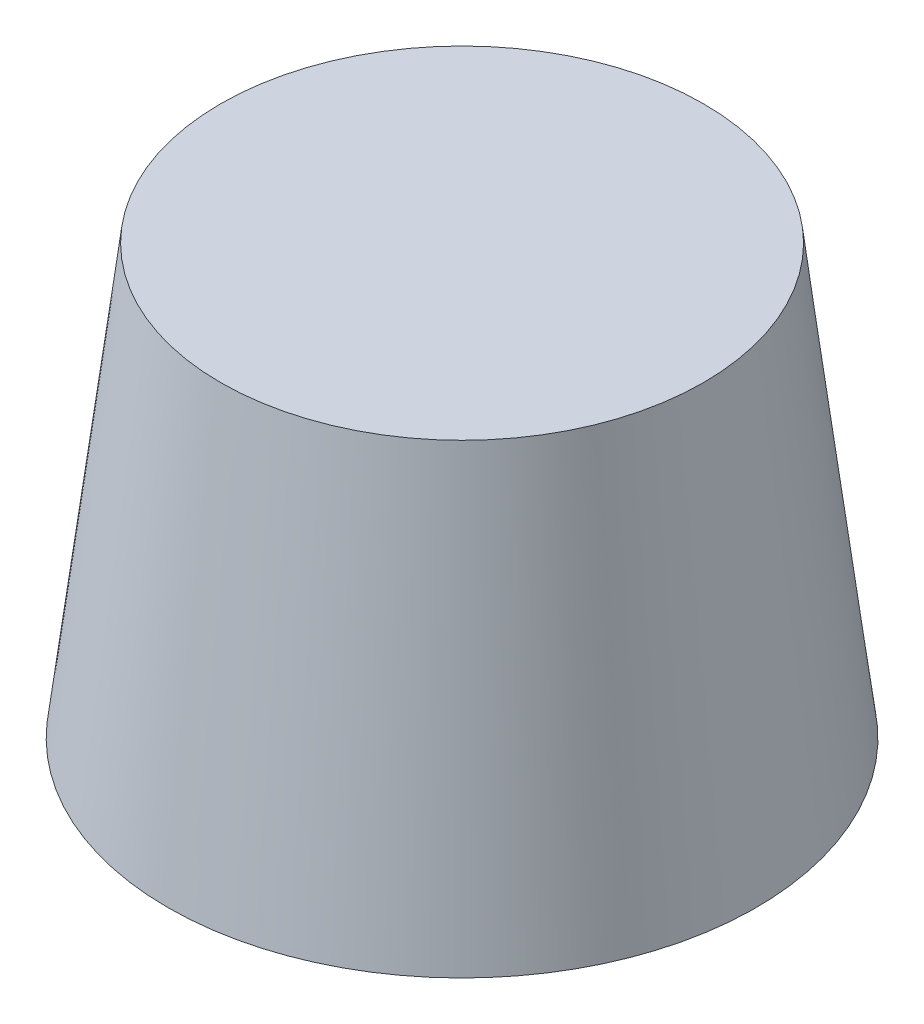
ISO-10303-21;
HEADER;
FILE_DESCRIPTION(('STEP AP214'),'2;1');
FILE_NAME('part.step','',(''),(''),'','','');
FILE_SCHEMA(('AUTOMOTIVE_DESIGN { 1 0 10303 214 1 1 1 1 }'));
ENDSEC;
DATA;
#1=APPLICATION_CONTEXT('core data for automotive mechanical design processes');
#2=APPLICATION_PROTOCOL_DEFINITION('international standard','automotive_design',2000,#1);
#3=PRODUCT_CONTEXT('',#1,'mechanical');
#4=PRODUCT('Part','Part','',(#3));
#5=PRODUCT_RELATED_PRODUCT_CATEGORY('part','',(#4));
#6=PRODUCT_DEFINITION_FORMATION('','',#4);
#7=PRODUCT_DEFINITION_CONTEXT('part definition',#1,'design');
#8=PRODUCT_DEFINITION('design','',#6,#7);
#9=PRODUCT_DEFINITION_SHAPE('','',#8);
#10=(LENGTH_UNIT() NAMED_UNIT(*) SI_UNIT(.MILLI.,.METRE.));
#11=(NAMED_UNIT(*) PLANE_ANGLE_UNIT() SI_UNIT($,.RADIAN.));
#12=(NAMED_UNIT(*) SI_UNIT($,.STERADIAN.) SOLID_ANGLE_UNIT());
#13=UNCERTAINTY_MEASURE_WITH_UNIT(LENGTH_MEASURE(1.E-05),#10,'distance_accuracy_value','');
#14=(GEOMETRIC_REPRESENTATION_CONTEXT(3) GLOBAL_UNCERTAINTY_ASSIGNED_CONTEXT((#13)) GLOBAL_UNIT_ASSIGNED_CONTEXT((#10,
#11,#12)) REPRESENTATION_CONTEXT('',''));
#15=CARTESIAN_POINT('',(0.,0.,0.));
#16=DIRECTION('',(0.,0.,1.));
#17=DIRECTION('',(1.,0.,0.));
#18=AXIS2_PLACEMENT_3D('',#15,#16,#17);
#19=CARTESIAN_POINT('',(0.,0.,0.));
#20=DIRECTION('',(0.,-1.,0.));
#21=DIRECTION('',(0.,0.,1.));
#22=AXIS2_PLACEMENT_3D('',#19,#20,#21);
#23=CONICAL_SURFACE('',#22,7.9375,0.122173047639603);
#24=CARTESIAN_POINT('',(0.,-6.35,0.));
#25=DIRECTION('',(0.,1.,0.));
#26=DIRECTION('',(0.,0.,1.));
#27=AXIS2_PLACEMENT_3D('',#24,#25,#26);
#28=CIRCLE('',#27,8.71718196173344);
#29=CARTESIAN_POINT('',(0.,-6.35,8.71718196173344));
#30=VERTEX_POINT('',#29);
#31=EDGE_CURVE('E10',#30,#30,#28,.T.);
#32=ORIENTED_EDGE('',*,*,#31,.T.);
#33=EDGE_LOOP('',(#32));
#34=FACE_BOUND('',#33,.T.);
#35=CARTESIAN_POINT('',(0.,6.35,0.));
#36=DIRECTION('',(0.,1.,0.));
#37=DIRECTION('',(0.,0.,1.));
#38=AXIS2_PLACEMENT_3D('',#35,#36,#37);
#39=CIRCLE('',#38,7.15781803826656);
#40=CARTESIAN_POINT('',(0.,6.35,7.15781803826656));
#41=VERTEX_POINT('',#40);
#42=EDGE_CURVE('E45',#41,#41,#39,.T.);
#43=ORIENTED_EDGE('',*,*,#42,.F.);
#44=EDGE_LOOP('',(#43));
#45=FACE_BOUND('',#44,.T.);
#46=ADVANCED_FACE('F38',(#34,#45),#23,.T.);
#47=CARTESIAN_POINT('',(0.,-6.35,0.));
#48=DIRECTION('',(0.,1.,0.));
#49=DIRECTION('',(0.,0.,1.));
#50=AXIS2_PLACEMENT_3D('',#47,#48,#49);
#51=PLANE('',#50);
#52=ORIENTED_EDGE('',*,*,#31,.F.);
#53=EDGE_LOOP('',(#52));
#54=FACE_BOUND('',#53,.T.);
#55=ADVANCED_FACE('F51',(#54),#51,.F.);
#56=CARTESIAN_POINT('',(0.,6.35,0.));
#57=DIRECTION('',(0.,1.,0.));
#58=DIRECTION('',(0.,0.,1.));
#59=AXIS2_PLACEMENT_3D('',#56,#57,#58);
#60=PLANE('',#59);
#61=ORIENTED_EDGE('',*,*,#42,.T.);
#62=EDGE_LOOP('',(#61));
#63=FACE_BOUND('',#62,.T.);
#64=ADVANCED_FACE('F48',(#63),#60,.T.);
#65=CLOSED_SHELL('',(#46,#55,#64));
#66=MANIFOLD_SOLID_BREP('B2',#65);
#67=ADVANCED_BREP_SHAPE_REPRESENTATION('',(#18,#66),#14);
#68=SHAPE_DEFINITION_REPRESENTATION(#9,#67);
ENDSEC;
END-ISO-10303-21;
